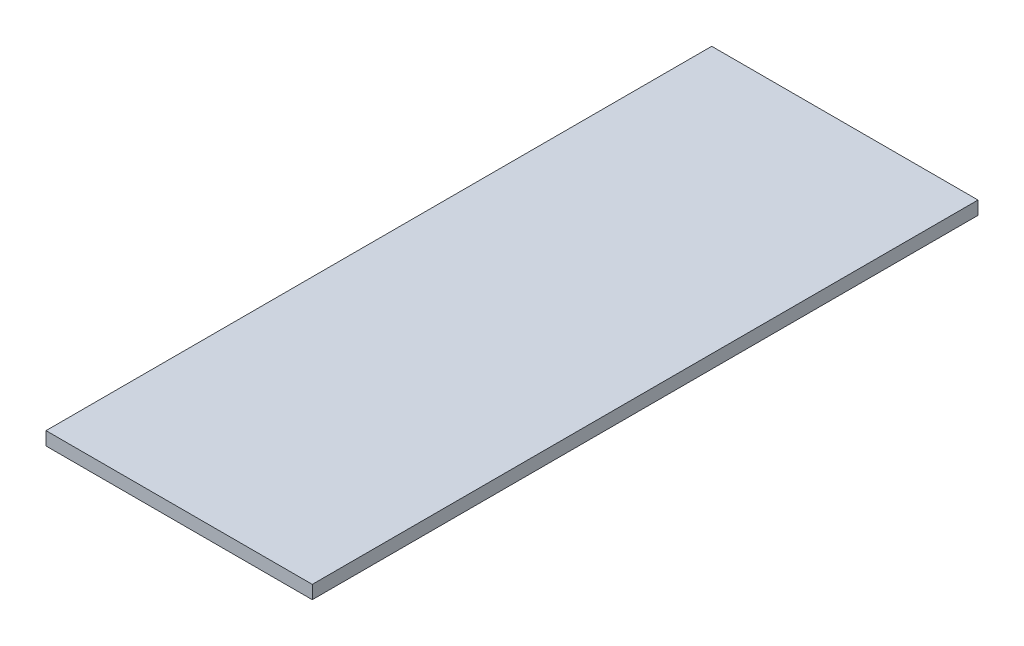
ISO-10303-21;
HEADER;
FILE_DESCRIPTION(('STEP AP214'),'2;1');
FILE_NAME('part.step','',(''),(''),'','','');
FILE_SCHEMA(('AUTOMOTIVE_DESIGN { 1 0 10303 214 1 1 1 1 }'));
ENDSEC;
DATA;
#1=APPLICATION_CONTEXT('core data for automotive mechanical design processes');
#2=APPLICATION_PROTOCOL_DEFINITION('international standard','automotive_design',2000,#1);
#3=PRODUCT_CONTEXT('',#1,'mechanical');
#4=PRODUCT('Part','Part','',(#3));
#5=PRODUCT_RELATED_PRODUCT_CATEGORY('part','',(#4));
#6=PRODUCT_DEFINITION_FORMATION('','',#4);
#7=PRODUCT_DEFINITION_CONTEXT('part definition',#1,'design');
#8=PRODUCT_DEFINITION('design','',#6,#7);
#9=PRODUCT_DEFINITION_SHAPE('','',#8);
#10=(LENGTH_UNIT() NAMED_UNIT(*) SI_UNIT(.MILLI.,.METRE.));
#11=(NAMED_UNIT(*) PLANE_ANGLE_UNIT() SI_UNIT($,.RADIAN.));
#12=(NAMED_UNIT(*) SI_UNIT($,.STERADIAN.) SOLID_ANGLE_UNIT());
#13=UNCERTAINTY_MEASURE_WITH_UNIT(LENGTH_MEASURE(1.E-05),#10,'distance_accuracy_value','');
#14=(GEOMETRIC_REPRESENTATION_CONTEXT(3) GLOBAL_UNCERTAINTY_ASSIGNED_CONTEXT((#13)) GLOBAL_UNIT_ASSIGNED_CONTEXT((#10,
#11,#12)) REPRESENTATION_CONTEXT('',''));
#15=CARTESIAN_POINT('',(0.,0.,0.));
#16=DIRECTION('',(0.,0.,1.));
#17=DIRECTION('',(1.,0.,0.));
#18=AXIS2_PLACEMENT_3D('',#15,#16,#17);
#19=CARTESIAN_POINT('',(10.,1.,25.));
#20=DIRECTION('',(-1.,0.,0.));
#21=DIRECTION('',(0.,0.,1.));
#22=AXIS2_PLACEMENT_3D('',#19,#20,#21);
#23=PLANE('',#22);
#24=DIRECTION('',(0.,0.,-1.));
#25=VECTOR('',#24,1.);
#26=CARTESIAN_POINT('',(10.,0.,25.));
#27=LINE('',#26,#25);
#28=CARTESIAN_POINT('',(10.,0.,25.));
#29=VERTEX_POINT('',#28);
#30=CARTESIAN_POINT('',(10.,0.,-25.));
#31=VERTEX_POINT('',#30);
#32=EDGE_CURVE('E97',#29,#31,#27,.T.);
#33=ORIENTED_EDGE('',*,*,#32,.T.);
#34=DIRECTION('',(0.,-1.,0.));
#35=VECTOR('',#34,1.);
#36=CARTESIAN_POINT('',(10.,1.,-25.));
#37=LINE('',#36,#35);
#38=CARTESIAN_POINT('',(10.,1.,-25.));
#39=VERTEX_POINT('',#38);
#40=EDGE_CURVE('E11',#39,#31,#37,.T.);
#41=ORIENTED_EDGE('',*,*,#40,.F.);
#42=DIRECTION('',(0.,0.,-1.));
#43=VECTOR('',#42,1.);
#44=CARTESIAN_POINT('',(10.,1.,25.));
#45=LINE('',#44,#43);
#46=CARTESIAN_POINT('',(10.,1.,25.));
#47=VERTEX_POINT('',#46);
#48=EDGE_CURVE('E85',#47,#39,#45,.T.);
#49=ORIENTED_EDGE('',*,*,#48,.F.);
#50=DIRECTION('',(0.,-1.,0.));
#51=VECTOR('',#50,1.);
#52=CARTESIAN_POINT('',(10.,1.,25.));
#53=LINE('',#52,#51);
#54=EDGE_CURVE('E93',#47,#29,#53,.T.);
#55=ORIENTED_EDGE('',*,*,#54,.T.);
#56=EDGE_LOOP('',(#33,#41,#49,#55));
#57=FACE_BOUND('',#56,.T.);
#58=ADVANCED_FACE('F34',(#57),#23,.F.);
#59=CARTESIAN_POINT('',(-10.,1.,-25.));
#60=DIRECTION('',(0.,0.,1.));
#61=DIRECTION('',(1.,0.,0.));
#62=AXIS2_PLACEMENT_3D('',#59,#60,#61);
#63=PLANE('',#62);
#64=DIRECTION('',(-1.,0.,0.));
#65=VECTOR('',#64,1.);
#66=CARTESIAN_POINT('',(-10.,0.,-25.));
#67=LINE('',#66,#65);
#68=CARTESIAN_POINT('',(-10.,0.,-25.));
#69=VERTEX_POINT('',#68);
#70=EDGE_CURVE('E89',#31,#69,#67,.T.);
#71=ORIENTED_EDGE('',*,*,#70,.T.);
#72=DIRECTION('',(0.,-1.,0.));
#73=VECTOR('',#72,1.);
#74=CARTESIAN_POINT('',(-10.,1.,-25.));
#75=LINE('',#74,#73);
#76=CARTESIAN_POINT('',(-10.,1.,-25.));
#77=VERTEX_POINT('',#76);
#78=EDGE_CURVE('E42',#77,#69,#75,.T.);
#79=ORIENTED_EDGE('',*,*,#78,.F.);
#80=DIRECTION('',(-1.,0.,0.));
#81=VECTOR('',#80,1.);
#82=CARTESIAN_POINT('',(-10.,1.,-25.));
#83=LINE('',#82,#81);
#84=EDGE_CURVE('E80',#39,#77,#83,.T.);
#85=ORIENTED_EDGE('',*,*,#84,.F.);
#86=ORIENTED_EDGE('',*,*,#40,.T.);
#87=EDGE_LOOP('',(#71,#79,#85,#86));
#88=FACE_BOUND('',#87,.T.);
#89=ADVANCED_FACE('F88',(#88),#63,.F.);
#90=CARTESIAN_POINT('',(-10.,1.,25.));
#91=DIRECTION('',(1.,0.,0.));
#92=DIRECTION('',(0.,0.,-1.));
#93=AXIS2_PLACEMENT_3D('',#90,#91,#92);
#94=PLANE('',#93);
#95=DIRECTION('',(0.,0.,1.));
#96=VECTOR('',#95,1.);
#97=CARTESIAN_POINT('',(-10.,0.,25.));
#98=LINE('',#97,#96);
#99=CARTESIAN_POINT('',(-10.,0.,25.));
#100=VERTEX_POINT('',#99);
#101=EDGE_CURVE('E67',#69,#100,#98,.T.);
#102=ORIENTED_EDGE('',*,*,#101,.T.);
#103=DIRECTION('',(0.,-1.,0.));
#104=VECTOR('',#103,1.);
#105=CARTESIAN_POINT('',(-10.,1.,25.));
#106=LINE('',#105,#104);
#107=CARTESIAN_POINT('',(-10.,1.,25.));
#108=VERTEX_POINT('',#107);
#109=EDGE_CURVE('E90',#108,#100,#106,.T.);
#110=ORIENTED_EDGE('',*,*,#109,.F.);
#111=DIRECTION('',(0.,0.,1.));
#112=VECTOR('',#111,1.);
#113=CARTESIAN_POINT('',(-10.,1.,25.));
#114=LINE('',#113,#112);
#115=EDGE_CURVE('E83',#77,#108,#114,.T.);
#116=ORIENTED_EDGE('',*,*,#115,.F.);
#117=ORIENTED_EDGE('',*,*,#78,.T.);
#118=EDGE_LOOP('',(#102,#110,#116,#117));
#119=FACE_BOUND('',#118,.T.);
#120=ADVANCED_FACE('F91',(#119),#94,.F.);
#121=CARTESIAN_POINT('',(-10.,1.,25.));
#122=DIRECTION('',(0.,0.,-1.));
#123=DIRECTION('',(-1.,0.,0.));
#124=AXIS2_PLACEMENT_3D('',#121,#122,#123);
#125=PLANE('',#124);
#126=DIRECTION('',(1.,0.,0.));
#127=VECTOR('',#126,1.);
#128=CARTESIAN_POINT('',(-10.,0.,25.));
#129=LINE('',#128,#127);
#130=EDGE_CURVE('E73',#100,#29,#129,.T.);
#131=ORIENTED_EDGE('',*,*,#130,.T.);
#132=ORIENTED_EDGE('',*,*,#54,.F.);
#133=DIRECTION('',(1.,0.,0.));
#134=VECTOR('',#133,1.);
#135=CARTESIAN_POINT('',(-10.,1.,25.));
#136=LINE('',#135,#134);
#137=EDGE_CURVE('E50',#108,#47,#136,.T.);
#138=ORIENTED_EDGE('',*,*,#137,.F.);
#139=ORIENTED_EDGE('',*,*,#109,.T.);
#140=EDGE_LOOP('',(#131,#132,#138,#139));
#141=FACE_BOUND('',#140,.T.);
#142=ADVANCED_FACE('F104',(#141),#125,.F.);
#143=CARTESIAN_POINT('',(0.,1.,0.));
#144=DIRECTION('',(0.,-1.,0.));
#145=DIRECTION('',(0.,0.,-1.));
#146=AXIS2_PLACEMENT_3D('',#143,#144,#145);
#147=PLANE('',#146);
#148=ORIENTED_EDGE('',*,*,#48,.T.);
#149=ORIENTED_EDGE('',*,*,#84,.T.);
#150=ORIENTED_EDGE('',*,*,#115,.T.);
#151=ORIENTED_EDGE('',*,*,#137,.T.);
#152=EDGE_LOOP('',(#148,#149,#150,#151));
#153=FACE_BOUND('',#152,.T.);
#154=ADVANCED_FACE('F81',(#153),#147,.F.);
#155=CARTESIAN_POINT('',(0.,0.,0.));
#156=DIRECTION('',(0.,-1.,0.));
#157=DIRECTION('',(0.,0.,-1.));
#158=AXIS2_PLACEMENT_3D('',#155,#156,#157);
#159=PLANE('',#158);
#160=ORIENTED_EDGE('',*,*,#32,.F.);
#161=ORIENTED_EDGE('',*,*,#130,.F.);
#162=ORIENTED_EDGE('',*,*,#101,.F.);
#163=ORIENTED_EDGE('',*,*,#70,.F.);
#164=EDGE_LOOP('',(#160,#161,#162,#163));
#165=FACE_BOUND('',#164,.T.);
#166=ADVANCED_FACE('F107',(#165),#159,.T.);
#167=CLOSED_SHELL('',(#58,#89,#120,#142,#154,#166));
#168=MANIFOLD_SOLID_BREP('B2',#167);
#169=ADVANCED_BREP_SHAPE_REPRESENTATION('',(#18,#168),#14);
#170=SHAPE_DEFINITION_REPRESENTATION(#9,#169);
ENDSEC;
END-ISO-10303-21;
